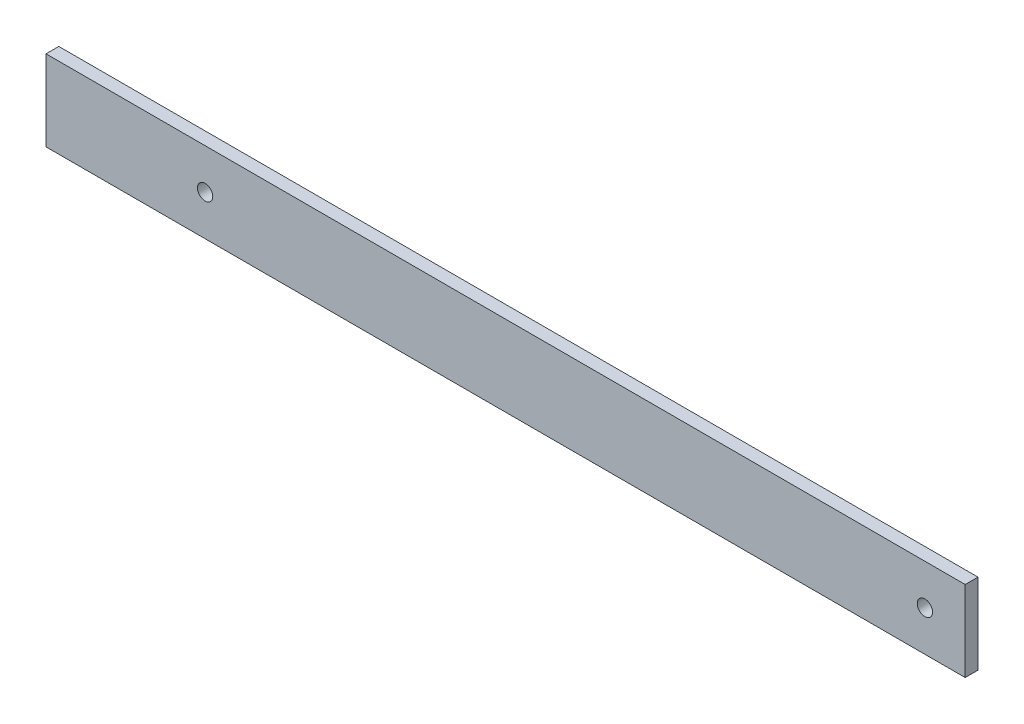
ISO-10303-21;
HEADER;
FILE_DESCRIPTION(('STEP AP214'),'2;1');
FILE_NAME('part.step','',(''),(''),'','','');
FILE_SCHEMA(('AUTOMOTIVE_DESIGN { 1 0 10303 214 1 1 1 1 }'));
ENDSEC;
DATA;
#1=APPLICATION_CONTEXT('core data for automotive mechanical design processes');
#2=APPLICATION_PROTOCOL_DEFINITION('international standard','automotive_design',2000,#1);
#3=PRODUCT_CONTEXT('',#1,'mechanical');
#4=PRODUCT('Part','Part','',(#3));
#5=PRODUCT_RELATED_PRODUCT_CATEGORY('part','',(#4));
#6=PRODUCT_DEFINITION_FORMATION('','',#4);
#7=PRODUCT_DEFINITION_CONTEXT('part definition',#1,'design');
#8=PRODUCT_DEFINITION('design','',#6,#7);
#9=PRODUCT_DEFINITION_SHAPE('','',#8);
#10=(LENGTH_UNIT() NAMED_UNIT(*) SI_UNIT(.MILLI.,.METRE.));
#11=(NAMED_UNIT(*) PLANE_ANGLE_UNIT() SI_UNIT($,.RADIAN.));
#12=(NAMED_UNIT(*) SI_UNIT($,.STERADIAN.) SOLID_ANGLE_UNIT());
#13=UNCERTAINTY_MEASURE_WITH_UNIT(LENGTH_MEASURE(1.E-05),#10,'distance_accuracy_value','');
#14=(GEOMETRIC_REPRESENTATION_CONTEXT(3) GLOBAL_UNCERTAINTY_ASSIGNED_CONTEXT((#13)) GLOBAL_UNIT_ASSIGNED_CONTEXT((#10,
#11,#12)) REPRESENTATION_CONTEXT('',''));
#15=CARTESIAN_POINT('',(0.,0.,0.));
#16=DIRECTION('',(0.,0.,1.));
#17=DIRECTION('',(1.,0.,0.));
#18=AXIS2_PLACEMENT_3D('',#15,#16,#17);
#19=CARTESIAN_POINT('',(0.,0.,-3.175));
#20=DIRECTION('',(-1.,0.,0.));
#21=DIRECTION('',(0.,0.,1.));
#22=AXIS2_PLACEMENT_3D('',#19,#20,#21);
#23=PLANE('',#22);
#24=DIRECTION('',(0.,-1.,0.));
#25=VECTOR('',#24,1.);
#26=CARTESIAN_POINT('',(0.,0.,0.));
#27=LINE('',#26,#25);
#28=CARTESIAN_POINT('',(0.,20.,0.));
#29=VERTEX_POINT('',#28);
#30=CARTESIAN_POINT('',(0.,0.,0.));
#31=VERTEX_POINT('',#30);
#32=EDGE_CURVE('E100',#29,#31,#27,.T.);
#33=ORIENTED_EDGE('',*,*,#32,.F.);
#34=DIRECTION('',(0.,0.,1.));
#35=VECTOR('',#34,1.);
#36=CARTESIAN_POINT('',(0.,20.,-3.175));
#37=LINE('',#36,#35);
#38=CARTESIAN_POINT('',(0.,20.,-3.175));
#39=VERTEX_POINT('',#38);
#40=EDGE_CURVE('E11',#39,#29,#37,.T.);
#41=ORIENTED_EDGE('',*,*,#40,.F.);
#42=DIRECTION('',(0.,-1.,0.));
#43=VECTOR('',#42,1.);
#44=CARTESIAN_POINT('',(0.,0.,-3.175));
#45=LINE('',#44,#43);
#46=CARTESIAN_POINT('',(0.,0.,-3.175));
#47=VERTEX_POINT('',#46);
#48=EDGE_CURVE('E93',#39,#47,#45,.T.);
#49=ORIENTED_EDGE('',*,*,#48,.T.);
#50=DIRECTION('',(0.,0.,1.));
#51=VECTOR('',#50,1.);
#52=CARTESIAN_POINT('',(0.,0.,-3.175));
#53=LINE('',#52,#51);
#54=EDGE_CURVE('E38',#47,#31,#53,.T.);
#55=ORIENTED_EDGE('',*,*,#54,.T.);
#56=EDGE_LOOP('',(#33,#41,#49,#55));
#57=FACE_BOUND('',#56,.T.);
#58=ADVANCED_FACE('F35',(#57),#23,.T.);
#59=CARTESIAN_POINT('',(0.,20.,-3.175));
#60=DIRECTION('',(0.,1.,0.));
#61=DIRECTION('',(0.,0.,1.));
#62=AXIS2_PLACEMENT_3D('',#59,#60,#61);
#63=PLANE('',#62);
#64=DIRECTION('',(-1.,0.,0.));
#65=VECTOR('',#64,1.);
#66=CARTESIAN_POINT('',(0.,20.,0.));
#67=LINE('',#66,#65);
#68=CARTESIAN_POINT('',(228.06,20.,0.));
#69=VERTEX_POINT('',#68);
#70=EDGE_CURVE('E95',#69,#29,#67,.T.);
#71=ORIENTED_EDGE('',*,*,#70,.F.);
#72=DIRECTION('',(0.,0.,1.));
#73=VECTOR('',#72,1.);
#74=CARTESIAN_POINT('',(228.06,20.,-3.175));
#75=LINE('',#74,#73);
#76=CARTESIAN_POINT('',(228.06,20.,-3.175));
#77=VERTEX_POINT('',#76);
#78=EDGE_CURVE('E44',#77,#69,#75,.T.);
#79=ORIENTED_EDGE('',*,*,#78,.F.);
#80=DIRECTION('',(-1.,0.,0.));
#81=VECTOR('',#80,1.);
#82=CARTESIAN_POINT('',(0.,20.,-3.175));
#83=LINE('',#82,#81);
#84=EDGE_CURVE('E90',#77,#39,#83,.T.);
#85=ORIENTED_EDGE('',*,*,#84,.T.);
#86=ORIENTED_EDGE('',*,*,#40,.T.);
#87=EDGE_LOOP('',(#71,#79,#85,#86));
#88=FACE_BOUND('',#87,.T.);
#89=ADVANCED_FACE('F111',(#88),#63,.T.);
#90=CARTESIAN_POINT('',(228.06,0.,-3.175));
#91=DIRECTION('',(1.,0.,0.));
#92=DIRECTION('',(0.,0.,-1.));
#93=AXIS2_PLACEMENT_3D('',#90,#91,#92);
#94=PLANE('',#93);
#95=DIRECTION('',(0.,1.,0.));
#96=VECTOR('',#95,1.);
#97=CARTESIAN_POINT('',(228.06,0.,0.));
#98=LINE('',#97,#96);
#99=CARTESIAN_POINT('',(228.06,0.,0.));
#100=VERTEX_POINT('',#99);
#101=EDGE_CURVE('E85',#100,#69,#98,.T.);
#102=ORIENTED_EDGE('',*,*,#101,.F.);
#103=DIRECTION('',(0.,0.,1.));
#104=VECTOR('',#103,1.);
#105=CARTESIAN_POINT('',(228.06,0.,-3.175));
#106=LINE('',#105,#104);
#107=CARTESIAN_POINT('',(228.06,0.,-3.175));
#108=VERTEX_POINT('',#107);
#109=EDGE_CURVE('E80',#108,#100,#106,.T.);
#110=ORIENTED_EDGE('',*,*,#109,.F.);
#111=DIRECTION('',(0.,1.,0.));
#112=VECTOR('',#111,1.);
#113=CARTESIAN_POINT('',(228.06,0.,-3.175));
#114=LINE('',#113,#112);
#115=EDGE_CURVE('E83',#108,#77,#114,.T.);
#116=ORIENTED_EDGE('',*,*,#115,.T.);
#117=ORIENTED_EDGE('',*,*,#78,.T.);
#118=EDGE_LOOP('',(#102,#110,#116,#117));
#119=FACE_BOUND('',#118,.T.);
#120=ADVANCED_FACE('F82',(#119),#94,.T.);
#121=CARTESIAN_POINT('',(0.,0.,-3.175));
#122=DIRECTION('',(0.,-1.,0.));
#123=DIRECTION('',(0.,0.,-1.));
#124=AXIS2_PLACEMENT_3D('',#121,#122,#123);
#125=PLANE('',#124);
#126=DIRECTION('',(1.,0.,0.));
#127=VECTOR('',#126,1.);
#128=CARTESIAN_POINT('',(0.,0.,0.));
#129=LINE('',#128,#127);
#130=EDGE_CURVE('E103',#31,#100,#129,.T.);
#131=ORIENTED_EDGE('',*,*,#130,.F.);
#132=ORIENTED_EDGE('',*,*,#54,.F.);
#133=DIRECTION('',(1.,0.,0.));
#134=VECTOR('',#133,1.);
#135=CARTESIAN_POINT('',(0.,0.,-3.175));
#136=LINE('',#135,#134);
#137=EDGE_CURVE('E89',#47,#108,#136,.T.);
#138=ORIENTED_EDGE('',*,*,#137,.T.);
#139=ORIENTED_EDGE('',*,*,#109,.T.);
#140=EDGE_LOOP('',(#131,#132,#138,#139));
#141=FACE_BOUND('',#140,.T.);
#142=ADVANCED_FACE('F92',(#141),#125,.T.);
#143=CARTESIAN_POINT('',(0.,0.,-3.175));
#144=DIRECTION('',(0.,0.,-1.));
#145=DIRECTION('',(-1.,0.,0.));
#146=AXIS2_PLACEMENT_3D('',#143,#144,#145);
#147=PLANE('',#146);
#148=CARTESIAN_POINT('',(218.06,10.,-3.175));
#149=DIRECTION('',(0.,0.,-1.));
#150=DIRECTION('',(-1.,0.,0.));
#151=AXIS2_PLACEMENT_3D('',#148,#149,#150);
#152=CIRCLE('',#151,1.89865);
#153=CARTESIAN_POINT('',(216.16135,10.,-3.175));
#154=VERTEX_POINT('',#153);
#155=EDGE_CURVE('E144',#154,#154,#152,.F.);
#156=ORIENTED_EDGE('',*,*,#155,.T.);
#157=EDGE_LOOP('',(#156));
#158=FACE_BOUND('',#157,.T.);
#159=CARTESIAN_POINT('',(39.475,10.,-3.175));
#160=DIRECTION('',(0.,0.,-1.));
#161=DIRECTION('',(-1.,0.,0.));
#162=AXIS2_PLACEMENT_3D('',#159,#160,#161);
#163=CIRCLE('',#162,1.89864999999999);
#164=CARTESIAN_POINT('',(37.57635,10.,-3.175));
#165=VERTEX_POINT('',#164);
#166=EDGE_CURVE('E104',#165,#165,#163,.F.);
#167=ORIENTED_EDGE('',*,*,#166,.T.);
#168=EDGE_LOOP('',(#167));
#169=FACE_BOUND('',#168,.T.);
#170=ORIENTED_EDGE('',*,*,#48,.F.);
#171=ORIENTED_EDGE('',*,*,#84,.F.);
#172=ORIENTED_EDGE('',*,*,#115,.F.);
#173=ORIENTED_EDGE('',*,*,#137,.F.);
#174=EDGE_LOOP('',(#170,#171,#172,#173));
#175=FACE_BOUND('',#174,.T.);
#176=ADVANCED_FACE('F88',(#158,#169,#175),#147,.T.);
#177=CARTESIAN_POINT('',(0.,0.,0.));
#178=DIRECTION('',(0.,0.,-1.));
#179=DIRECTION('',(-1.,0.,0.));
#180=AXIS2_PLACEMENT_3D('',#177,#178,#179);
#181=PLANE('',#180);
#182=CARTESIAN_POINT('',(218.06,10.,0.));
#183=DIRECTION('',(0.,0.,1.));
#184=DIRECTION('',(1.,0.,0.));
#185=AXIS2_PLACEMENT_3D('',#182,#183,#184);
#186=CIRCLE('',#185,1.89865);
#187=CARTESIAN_POINT('',(219.95865,10.,0.));
#188=VERTEX_POINT('',#187);
#189=EDGE_CURVE('E147',#188,#188,#186,.T.);
#190=ORIENTED_EDGE('',*,*,#189,.F.);
#191=EDGE_LOOP('',(#190));
#192=FACE_BOUND('',#191,.T.);
#193=CARTESIAN_POINT('',(39.475,10.,0.));
#194=DIRECTION('',(0.,0.,1.));
#195=DIRECTION('',(1.,0.,0.));
#196=AXIS2_PLACEMENT_3D('',#193,#194,#195);
#197=CIRCLE('',#196,1.89864999999999);
#198=CARTESIAN_POINT('',(41.37365,10.,0.));
#199=VERTEX_POINT('',#198);
#200=EDGE_CURVE('E149',#199,#199,#197,.T.);
#201=ORIENTED_EDGE('',*,*,#200,.F.);
#202=EDGE_LOOP('',(#201));
#203=FACE_BOUND('',#202,.T.);
#204=ORIENTED_EDGE('',*,*,#32,.T.);
#205=ORIENTED_EDGE('',*,*,#130,.T.);
#206=ORIENTED_EDGE('',*,*,#101,.T.);
#207=ORIENTED_EDGE('',*,*,#70,.T.);
#208=EDGE_LOOP('',(#204,#205,#206,#207));
#209=FACE_BOUND('',#208,.T.);
#210=ADVANCED_FACE('F110',(#192,#203,#209),#181,.F.);
#211=CARTESIAN_POINT('',(39.475,10.,0.));
#212=DIRECTION('',(0.,0.,1.));
#213=DIRECTION('',(1.,0.,0.));
#214=AXIS2_PLACEMENT_3D('',#211,#212,#213);
#215=CYLINDRICAL_SURFACE('',#214,1.89864999999999);
#216=ORIENTED_EDGE('',*,*,#166,.F.);
#217=EDGE_LOOP('',(#216));
#218=FACE_BOUND('',#217,.T.);
#219=ORIENTED_EDGE('',*,*,#200,.T.);
#220=EDGE_LOOP('',(#219));
#221=FACE_BOUND('',#220,.T.);
#222=ADVANCED_FACE('F129',(#218,#221),#215,.F.);
#223=CARTESIAN_POINT('',(218.06,10.,0.));
#224=DIRECTION('',(0.,0.,1.));
#225=DIRECTION('',(1.,0.,0.));
#226=AXIS2_PLACEMENT_3D('',#223,#224,#225);
#227=CYLINDRICAL_SURFACE('',#226,1.89865);
#228=ORIENTED_EDGE('',*,*,#155,.F.);
#229=EDGE_LOOP('',(#228));
#230=FACE_BOUND('',#229,.T.);
#231=ORIENTED_EDGE('',*,*,#189,.T.);
#232=EDGE_LOOP('',(#231));
#233=FACE_BOUND('',#232,.T.);
#234=ADVANCED_FACE('F136',(#230,#233),#227,.F.);
#235=CLOSED_SHELL('',(#58,#89,#120,#142,#176,#210,#222,#234));
#236=MANIFOLD_SOLID_BREP('B2',#235);
#237=ADVANCED_BREP_SHAPE_REPRESENTATION('',(#18,#236),#14);
#238=SHAPE_DEFINITION_REPRESENTATION(#9,#237);
ENDSEC;
END-ISO-10303-21;
